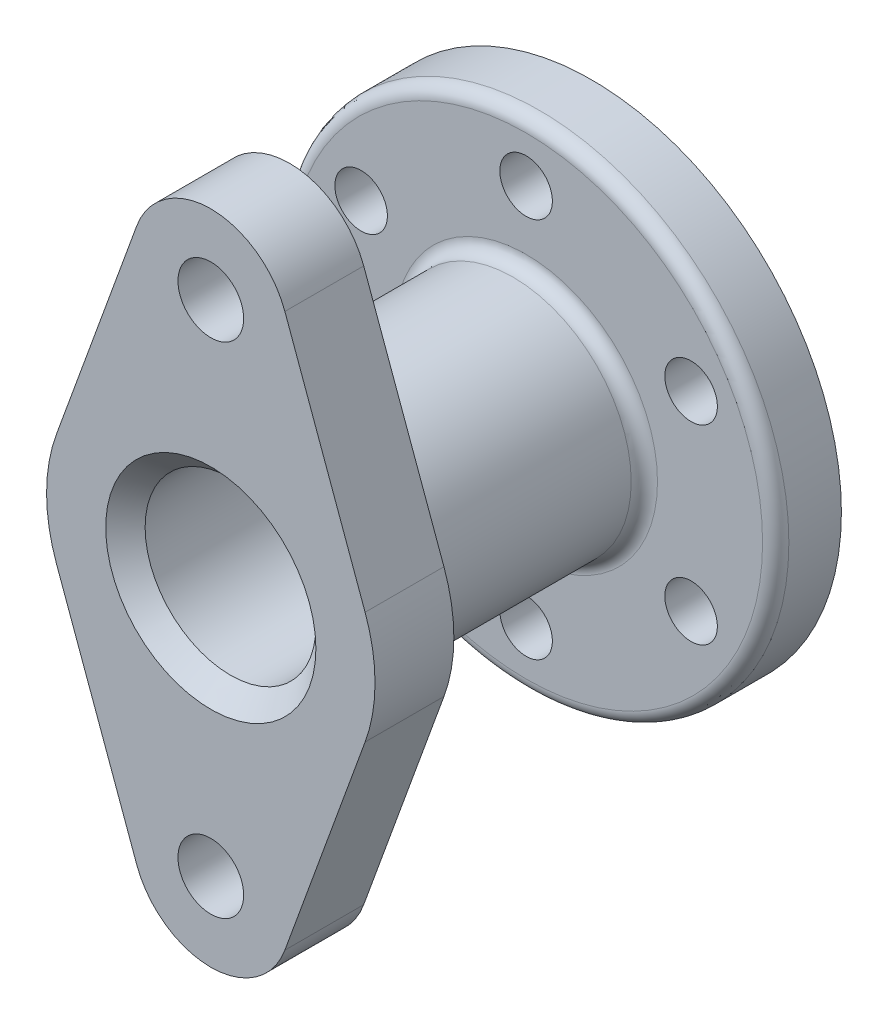
ISO-10303-21;
HEADER;
FILE_DESCRIPTION(('STEP AP214'),'2;1');
FILE_NAME('part.step','',(''),(''),'','','');
FILE_SCHEMA(('AUTOMOTIVE_DESIGN { 1 0 10303 214 1 1 1 1 }'));
ENDSEC;
DATA;
#1=APPLICATION_CONTEXT('core data for automotive mechanical design processes');
#2=APPLICATION_PROTOCOL_DEFINITION('international standard','automotive_design',2000,#1);
#3=PRODUCT_CONTEXT('',#1,'mechanical');
#4=PRODUCT('Part','Part','',(#3));
#5=PRODUCT_RELATED_PRODUCT_CATEGORY('part','',(#4));
#6=PRODUCT_DEFINITION_FORMATION('','',#4);
#7=PRODUCT_DEFINITION_CONTEXT('part definition',#1,'design');
#8=PRODUCT_DEFINITION('design','',#6,#7);
#9=PRODUCT_DEFINITION_SHAPE('','',#8);
#10=(LENGTH_UNIT() NAMED_UNIT(*) SI_UNIT(.MILLI.,.METRE.));
#11=(NAMED_UNIT(*) PLANE_ANGLE_UNIT() SI_UNIT($,.RADIAN.));
#12=(NAMED_UNIT(*) SI_UNIT($,.STERADIAN.) SOLID_ANGLE_UNIT());
#13=UNCERTAINTY_MEASURE_WITH_UNIT(LENGTH_MEASURE(1.E-05),#10,'distance_accuracy_value','');
#14=(GEOMETRIC_REPRESENTATION_CONTEXT(3) GLOBAL_UNCERTAINTY_ASSIGNED_CONTEXT((#13)) GLOBAL_UNIT_ASSIGNED_CONTEXT((#10,
#11,#12)) REPRESENTATION_CONTEXT('',''));
#15=CARTESIAN_POINT('',(0.,0.,0.));
#16=DIRECTION('',(0.,0.,1.));
#17=DIRECTION('',(1.,0.,0.));
#18=AXIS2_PLACEMENT_3D('',#15,#16,#17);
#19=CARTESIAN_POINT('',(0.,0.,0.));
#20=DIRECTION('',(0.,0.,-1.));
#21=DIRECTION('',(-1.,0.,0.));
#22=AXIS2_PLACEMENT_3D('',#19,#20,#21);
#23=CYLINDRICAL_SURFACE('',#22,18.);
#24=CARTESIAN_POINT('',(0.,0.,44.));
#25=DIRECTION('',(0.,0.,1.));
#26=DIRECTION('',(1.,0.,0.));
#27=AXIS2_PLACEMENT_3D('',#24,#25,#26);
#28=CIRCLE('',#27,18.);
#29=CARTESIAN_POINT('',(18.,0.,44.));
#30=VERTEX_POINT('',#29);
#31=EDGE_CURVE('E219',#30,#30,#28,.F.);
#32=ORIENTED_EDGE('',*,*,#31,.T.);
#33=EDGE_LOOP('',(#32));
#34=FACE_BOUND('',#33,.T.);
#35=CARTESIAN_POINT('',(0.,0.,12.));
#36=DIRECTION('',(0.,0.,1.));
#37=DIRECTION('',(1.,0.,0.));
#38=AXIS2_PLACEMENT_3D('',#35,#36,#37);
#39=CIRCLE('',#38,18.);
#40=CARTESIAN_POINT('',(18.,0.,12.));
#41=VERTEX_POINT('',#40);
#42=EDGE_CURVE('E216',#41,#41,#39,.T.);
#43=ORIENTED_EDGE('',*,*,#42,.T.);
#44=EDGE_LOOP('',(#43));
#45=FACE_BOUND('',#44,.T.);
#46=ADVANCED_FACE('F30',(#34,#45),#23,.T.);
#47=CARTESIAN_POINT('',(0.,0.,0.));
#48=DIRECTION('',(0.,0.,-1.));
#49=DIRECTION('',(-1.,0.,0.));
#50=AXIS2_PLACEMENT_3D('',#47,#48,#49);
#51=PLANE('',#50);
#52=CARTESIAN_POINT('',(0.,0.,0.));
#53=DIRECTION('',(0.,0.,-1.));
#54=DIRECTION('',(-1.,0.,0.));
#55=AXIS2_PLACEMENT_3D('',#52,#53,#54);
#56=CIRCLE('',#55,9.99999999999999);
#57=CARTESIAN_POINT('',(-9.99999999999999,0.,0.));
#58=VERTEX_POINT('',#57);
#59=EDGE_CURVE('E550',#58,#58,#56,.T.);
#60=ORIENTED_EDGE('',*,*,#59,.F.);
#61=EDGE_LOOP('',(#60));
#62=FACE_BOUND('',#61,.T.);
#63=CARTESIAN_POINT('',(-25.1147367097486,14.5000000000003,0.));
#64=DIRECTION('',(0.,0.,1.));
#65=DIRECTION('',(0.50000000000001,0.866025403784433,0.));
#66=AXIS2_PLACEMENT_3D('',#63,#64,#65);
#67=CIRCLE('',#66,4.);
#68=CARTESIAN_POINT('',(-23.1147367097485,17.964101615138,0.));
#69=VERTEX_POINT('',#68);
#70=EDGE_CURVE('E172',#69,#69,#67,.T.);
#71=ORIENTED_EDGE('',*,*,#70,.T.);
#72=EDGE_LOOP('',(#71));
#73=FACE_BOUND('',#72,.T.);
#74=CARTESIAN_POINT('',(-25.1147367097489,-14.4999999999998,0.));
#75=DIRECTION('',(0.,0.,1.));
#76=DIRECTION('',(-0.499999999999992,0.866025403784443,0.));
#77=AXIS2_PLACEMENT_3D('',#74,#75,#76);
#78=CIRCLE('',#77,4.);
#79=CARTESIAN_POINT('',(-27.1147367097488,-11.035898384862,0.));
#80=VERTEX_POINT('',#79);
#81=EDGE_CURVE('E178',#80,#80,#78,.T.);
#82=ORIENTED_EDGE('',*,*,#81,.T.);
#83=EDGE_LOOP('',(#82));
#84=FACE_BOUND('',#83,.T.);
#85=CARTESIAN_POINT('',(-2.02506034944344E-13,-29.,0.));
#86=DIRECTION('',(0.,0.,1.));
#87=DIRECTION('',(-1.,0.,0.));
#88=AXIS2_PLACEMENT_3D('',#85,#86,#87);
#89=CIRCLE('',#88,4.);
#90=CARTESIAN_POINT('',(-4.0000000000002,-29.,0.));
#91=VERTEX_POINT('',#90);
#92=EDGE_CURVE('E184',#91,#91,#89,.T.);
#93=ORIENTED_EDGE('',*,*,#92,.T.);
#94=EDGE_LOOP('',(#93));
#95=FACE_BOUND('',#94,.T.);
#96=CARTESIAN_POINT('',(25.1147367097487,-14.5000000000001,0.));
#97=DIRECTION('',(0.,0.,1.));
#98=DIRECTION('',(-0.500000000000004,-0.866025403784436,0.));
#99=AXIS2_PLACEMENT_3D('',#96,#97,#98);
#100=CIRCLE('',#99,4.);
#101=CARTESIAN_POINT('',(23.1147367097486,-17.9641016151379,0.));
#102=VERTEX_POINT('',#101);
#103=EDGE_CURVE('E190',#102,#102,#100,.T.);
#104=ORIENTED_EDGE('',*,*,#103,.T.);
#105=EDGE_LOOP('',(#104));
#106=FACE_BOUND('',#105,.T.);
#107=CARTESIAN_POINT('',(25.1147367097488,14.4999999999999,0.));
#108=DIRECTION('',(0.,0.,1.));
#109=DIRECTION('',(0.499999999999998,-0.86602540378444,0.));
#110=AXIS2_PLACEMENT_3D('',#107,#108,#109);
#111=CIRCLE('',#110,4.);
#112=CARTESIAN_POINT('',(27.1147367097487,11.0358983848622,0.));
#113=VERTEX_POINT('',#112);
#114=EDGE_CURVE('E196',#113,#113,#111,.T.);
#115=ORIENTED_EDGE('',*,*,#114,.T.);
#116=EDGE_LOOP('',(#115));
#117=FACE_BOUND('',#116,.T.);
#118=CARTESIAN_POINT('',(0.,29.,0.));
#119=DIRECTION('',(0.,0.,1.));
#120=DIRECTION('',(1.,0.,0.));
#121=AXIS2_PLACEMENT_3D('',#118,#119,#120);
#122=CIRCLE('',#121,4.);
#123=CARTESIAN_POINT('',(4.,29.,0.));
#124=VERTEX_POINT('',#123);
#125=EDGE_CURVE('E202',#124,#124,#122,.T.);
#126=ORIENTED_EDGE('',*,*,#125,.T.);
#127=EDGE_LOOP('',(#126));
#128=FACE_BOUND('',#127,.T.);
#129=CARTESIAN_POINT('',(0.,0.,0.));
#130=DIRECTION('',(0.,0.,-1.));
#131=DIRECTION('',(-1.,0.,0.));
#132=AXIS2_PLACEMENT_3D('',#129,#130,#131);
#133=CIRCLE('',#132,38.);
#134=CARTESIAN_POINT('',(-38.,0.,0.));
#135=VERTEX_POINT('',#134);
#136=EDGE_CURVE('E205',#135,#135,#133,.T.);
#137=ORIENTED_EDGE('',*,*,#136,.T.);
#138=EDGE_LOOP('',(#137));
#139=FACE_BOUND('',#138,.T.);
#140=ADVANCED_FACE('F247',(#62,#73,#84,#95,#106,#117,#128,#139),#51,.T.);
#141=CARTESIAN_POINT('',(0.,0.,0.));
#142=DIRECTION('',(0.,0.,-1.));
#143=DIRECTION('',(-1.,0.,0.));
#144=AXIS2_PLACEMENT_3D('',#141,#142,#143);
#145=CYLINDRICAL_SURFACE('',#144,38.);
#146=CARTESIAN_POINT('',(0.,0.,8.));
#147=DIRECTION('',(0.,0.,1.));
#148=DIRECTION('',(1.,0.,0.));
#149=AXIS2_PLACEMENT_3D('',#146,#147,#148);
#150=CIRCLE('',#149,38.);
#151=CARTESIAN_POINT('',(38.,0.,8.));
#152=VERTEX_POINT('',#151);
#153=EDGE_CURVE('E11',#152,#152,#150,.F.);
#154=ORIENTED_EDGE('',*,*,#153,.T.);
#155=EDGE_LOOP('',(#154));
#156=FACE_BOUND('',#155,.T.);
#157=ORIENTED_EDGE('',*,*,#136,.F.);
#158=EDGE_LOOP('',(#157));
#159=FACE_BOUND('',#158,.T.);
#160=ADVANCED_FACE('F253',(#156,#159),#145,.T.);
#161=CARTESIAN_POINT('',(0.,38.,10.));
#162=DIRECTION('',(0.,0.,1.));
#163=DIRECTION('',(1.,0.,0.));
#164=AXIS2_PLACEMENT_3D('',#161,#162,#163);
#165=PLANE('',#164);
#166=CARTESIAN_POINT('',(0.,0.,10.));
#167=DIRECTION('',(0.,0.,1.));
#168=DIRECTION('',(1.,0.,0.));
#169=AXIS2_PLACEMENT_3D('',#166,#167,#168);
#170=CIRCLE('',#169,20.);
#171=CARTESIAN_POINT('',(20.,0.,10.));
#172=VERTEX_POINT('',#171);
#173=EDGE_CURVE('E39',#172,#172,#170,.F.);
#174=ORIENTED_EDGE('',*,*,#173,.T.);
#175=EDGE_LOOP('',(#174));
#176=FACE_BOUND('',#175,.T.);
#177=CARTESIAN_POINT('',(0.,0.,10.));
#178=DIRECTION('',(0.,0.,1.));
#179=DIRECTION('',(1.,0.,0.));
#180=AXIS2_PLACEMENT_3D('',#177,#178,#179);
#181=CIRCLE('',#180,36.);
#182=CARTESIAN_POINT('',(36.,0.,10.));
#183=VERTEX_POINT('',#182);
#184=EDGE_CURVE('E225',#183,#183,#181,.T.);
#185=ORIENTED_EDGE('',*,*,#184,.T.);
#186=EDGE_LOOP('',(#185));
#187=FACE_BOUND('',#186,.T.);
#188=CARTESIAN_POINT('',(-25.1147367097486,14.5000000000003,10.));
#189=DIRECTION('',(0.,0.,1.));
#190=DIRECTION('',(0.50000000000001,0.866025403784433,0.));
#191=AXIS2_PLACEMENT_3D('',#188,#189,#190);
#192=CIRCLE('',#191,4.);
#193=CARTESIAN_POINT('',(-23.1147367097485,17.964101615138,10.));
#194=VERTEX_POINT('',#193);
#195=EDGE_CURVE('E161',#194,#194,#192,.T.);
#196=ORIENTED_EDGE('',*,*,#195,.F.);
#197=EDGE_LOOP('',(#196));
#198=FACE_BOUND('',#197,.T.);
#199=CARTESIAN_POINT('',(-25.1147367097489,-14.4999999999998,10.));
#200=DIRECTION('',(0.,0.,1.));
#201=DIRECTION('',(-0.499999999999992,0.866025403784443,0.));
#202=AXIS2_PLACEMENT_3D('',#199,#200,#201);
#203=CIRCLE('',#202,4.);
#204=CARTESIAN_POINT('',(-27.1147367097488,-11.035898384862,10.));
#205=VERTEX_POINT('',#204);
#206=EDGE_CURVE('E175',#205,#205,#203,.T.);
#207=ORIENTED_EDGE('',*,*,#206,.F.);
#208=EDGE_LOOP('',(#207));
#209=FACE_BOUND('',#208,.T.);
#210=CARTESIAN_POINT('',(-2.02506034944344E-13,-29.,10.));
#211=DIRECTION('',(0.,0.,1.));
#212=DIRECTION('',(-1.,0.,0.));
#213=AXIS2_PLACEMENT_3D('',#210,#211,#212);
#214=CIRCLE('',#213,4.);
#215=CARTESIAN_POINT('',(-4.0000000000002,-29.,10.));
#216=VERTEX_POINT('',#215);
#217=EDGE_CURVE('E181',#216,#216,#214,.T.);
#218=ORIENTED_EDGE('',*,*,#217,.F.);
#219=EDGE_LOOP('',(#218));
#220=FACE_BOUND('',#219,.T.);
#221=CARTESIAN_POINT('',(25.1147367097487,-14.5000000000001,10.));
#222=DIRECTION('',(0.,0.,1.));
#223=DIRECTION('',(-0.500000000000004,-0.866025403784436,0.));
#224=AXIS2_PLACEMENT_3D('',#221,#222,#223);
#225=CIRCLE('',#224,4.);
#226=CARTESIAN_POINT('',(23.1147367097486,-17.9641016151379,10.));
#227=VERTEX_POINT('',#226);
#228=EDGE_CURVE('E187',#227,#227,#225,.T.);
#229=ORIENTED_EDGE('',*,*,#228,.F.);
#230=EDGE_LOOP('',(#229));
#231=FACE_BOUND('',#230,.T.);
#232=CARTESIAN_POINT('',(25.1147367097488,14.4999999999999,10.));
#233=DIRECTION('',(0.,0.,1.));
#234=DIRECTION('',(0.499999999999998,-0.86602540378444,0.));
#235=AXIS2_PLACEMENT_3D('',#232,#233,#234);
#236=CIRCLE('',#235,4.);
#237=CARTESIAN_POINT('',(27.1147367097487,11.0358983848622,10.));
#238=VERTEX_POINT('',#237);
#239=EDGE_CURVE('E193',#238,#238,#236,.T.);
#240=ORIENTED_EDGE('',*,*,#239,.F.);
#241=EDGE_LOOP('',(#240));
#242=FACE_BOUND('',#241,.T.);
#243=CARTESIAN_POINT('',(0.,29.,10.));
#244=DIRECTION('',(0.,0.,1.));
#245=DIRECTION('',(1.,0.,0.));
#246=AXIS2_PLACEMENT_3D('',#243,#244,#245);
#247=CIRCLE('',#246,4.);
#248=CARTESIAN_POINT('',(4.,29.,10.));
#249=VERTEX_POINT('',#248);
#250=EDGE_CURVE('E199',#249,#249,#247,.T.);
#251=ORIENTED_EDGE('',*,*,#250,.F.);
#252=EDGE_LOOP('',(#251));
#253=FACE_BOUND('',#252,.T.);
#254=ADVANCED_FACE('F230',(#176,#187,#198,#209,#220,#231,#242,#253),#165,.T.);
#255=CARTESIAN_POINT('',(0.,29.,0.));
#256=DIRECTION('',(0.,0.,1.));
#257=DIRECTION('',(1.,0.,0.));
#258=AXIS2_PLACEMENT_3D('',#255,#256,#257);
#259=CYLINDRICAL_SURFACE('',#258,4.);
#260=ORIENTED_EDGE('',*,*,#125,.F.);
#261=EDGE_LOOP('',(#260));
#262=FACE_BOUND('',#261,.T.);
#263=ORIENTED_EDGE('',*,*,#250,.T.);
#264=EDGE_LOOP('',(#263));
#265=FACE_BOUND('',#264,.T.);
#266=ADVANCED_FACE('F263',(#262,#265),#259,.F.);
#267=CARTESIAN_POINT('',(25.1147367097488,14.4999999999999,0.));
#268=DIRECTION('',(0.,0.,1.));
#269=DIRECTION('',(1.,0.,0.));
#270=AXIS2_PLACEMENT_3D('',#267,#268,#269);
#271=CYLINDRICAL_SURFACE('',#270,4.);
#272=ORIENTED_EDGE('',*,*,#114,.F.);
#273=EDGE_LOOP('',(#272));
#274=FACE_BOUND('',#273,.T.);
#275=ORIENTED_EDGE('',*,*,#239,.T.);
#276=EDGE_LOOP('',(#275));
#277=FACE_BOUND('',#276,.T.);
#278=ADVANCED_FACE('F342',(#274,#277),#271,.F.);
#279=CARTESIAN_POINT('',(25.1147367097487,-14.5000000000001,0.));
#280=DIRECTION('',(0.,0.,1.));
#281=DIRECTION('',(1.,0.,0.));
#282=AXIS2_PLACEMENT_3D('',#279,#280,#281);
#283=CYLINDRICAL_SURFACE('',#282,4.);
#284=ORIENTED_EDGE('',*,*,#103,.F.);
#285=EDGE_LOOP('',(#284));
#286=FACE_BOUND('',#285,.T.);
#287=ORIENTED_EDGE('',*,*,#228,.T.);
#288=EDGE_LOOP('',(#287));
#289=FACE_BOUND('',#288,.T.);
#290=ADVANCED_FACE('F338',(#286,#289),#283,.F.);
#291=CARTESIAN_POINT('',(-2.02506034944344E-13,-29.,0.));
#292=DIRECTION('',(0.,0.,1.));
#293=DIRECTION('',(1.,0.,0.));
#294=AXIS2_PLACEMENT_3D('',#291,#292,#293);
#295=CYLINDRICAL_SURFACE('',#294,4.);
#296=ORIENTED_EDGE('',*,*,#92,.F.);
#297=EDGE_LOOP('',(#296));
#298=FACE_BOUND('',#297,.T.);
#299=ORIENTED_EDGE('',*,*,#217,.T.);
#300=EDGE_LOOP('',(#299));
#301=FACE_BOUND('',#300,.T.);
#302=ADVANCED_FACE('F334',(#298,#301),#295,.F.);
#303=CARTESIAN_POINT('',(-25.1147367097489,-14.4999999999998,0.));
#304=DIRECTION('',(0.,0.,1.));
#305=DIRECTION('',(1.,0.,0.));
#306=AXIS2_PLACEMENT_3D('',#303,#304,#305);
#307=CYLINDRICAL_SURFACE('',#306,4.);
#308=ORIENTED_EDGE('',*,*,#81,.F.);
#309=EDGE_LOOP('',(#308));
#310=FACE_BOUND('',#309,.T.);
#311=ORIENTED_EDGE('',*,*,#206,.T.);
#312=EDGE_LOOP('',(#311));
#313=FACE_BOUND('',#312,.T.);
#314=ADVANCED_FACE('F330',(#310,#313),#307,.F.);
#315=CARTESIAN_POINT('',(-25.1147367097486,14.5000000000003,0.));
#316=DIRECTION('',(0.,0.,1.));
#317=DIRECTION('',(1.,0.,0.));
#318=AXIS2_PLACEMENT_3D('',#315,#316,#317);
#319=CYLINDRICAL_SURFACE('',#318,4.);
#320=ORIENTED_EDGE('',*,*,#70,.F.);
#321=EDGE_LOOP('',(#320));
#322=FACE_BOUND('',#321,.T.);
#323=ORIENTED_EDGE('',*,*,#195,.T.);
#324=EDGE_LOOP('',(#323));
#325=FACE_BOUND('',#324,.T.);
#326=ADVANCED_FACE('F325',(#322,#325),#319,.F.);
#327=CARTESIAN_POINT('',(0.,38.,46.));
#328=DIRECTION('',(0.,0.,1.));
#329=DIRECTION('',(1.,0.,0.));
#330=AXIS2_PLACEMENT_3D('',#327,#328,#329);
#331=CYLINDRICAL_SURFACE('',#330,12.);
#332=CARTESIAN_POINT('',(0.,38.,58.));
#333=DIRECTION('',(0.,0.,1.));
#334=DIRECTION('',(1.,0.,0.));
#335=AXIS2_PLACEMENT_3D('',#332,#333,#334);
#336=CIRCLE('',#335,12.);
#337=CARTESIAN_POINT('',(-11.275939624015,42.1052631578947,58.));
#338=VERTEX_POINT('',#337);
#339=CARTESIAN_POINT('',(11.275939624015,42.1052631578947,58.));
#340=VERTEX_POINT('',#339);
#341=EDGE_CURVE('E137',#338,#340,#336,.F.);
#342=ORIENTED_EDGE('',*,*,#341,.T.);
#343=DIRECTION('',(0.,0.,1.));
#344=VECTOR('',#343,1.);
#345=CARTESIAN_POINT('',(11.275939624015,42.1052631578947,46.));
#346=LINE('',#345,#344);
#347=CARTESIAN_POINT('',(11.275939624015,42.1052631578947,46.));
#348=VERTEX_POINT('',#347);
#349=EDGE_CURVE('E159',#348,#340,#346,.T.);
#350=ORIENTED_EDGE('',*,*,#349,.F.);
#351=CARTESIAN_POINT('',(0.,38.,46.));
#352=DIRECTION('',(0.,0.,1.));
#353=DIRECTION('',(1.,0.,0.));
#354=AXIS2_PLACEMENT_3D('',#351,#352,#353);
#355=CIRCLE('',#354,12.);
#356=CARTESIAN_POINT('',(-11.275939624015,42.1052631578947,46.));
#357=VERTEX_POINT('',#356);
#358=EDGE_CURVE('E556',#357,#348,#355,.F.);
#359=ORIENTED_EDGE('',*,*,#358,.F.);
#360=DIRECTION('',(0.,0.,1.));
#361=VECTOR('',#360,1.);
#362=CARTESIAN_POINT('',(-11.275939624015,42.1052631578947,46.));
#363=LINE('',#362,#361);
#364=EDGE_CURVE('E133',#357,#338,#363,.T.);
#365=ORIENTED_EDGE('',*,*,#364,.T.);
#366=EDGE_LOOP('',(#342,#350,#359,#365));
#367=FACE_BOUND('',#366,.T.);
#368=ADVANCED_FACE('F307',(#367),#331,.T.);
#369=CARTESIAN_POINT('',(51.4922890022177,-68.3571140504545,46.));
#370=DIRECTION('',(-0.939661635334585,-0.342105263157895,0.));
#371=DIRECTION('',(0.342105263157895,-0.939661635334586,0.));
#372=AXIS2_PLACEMENT_3D('',#369,#370,#371);
#373=PLANE('',#372);
#374=DIRECTION('',(0.342105263157895,-0.939661635334586,0.));
#375=VECTOR('',#374,1.);
#376=CARTESIAN_POINT('',(51.4922890022177,-68.3571140504545,58.));
#377=LINE('',#376,#375);
#378=CARTESIAN_POINT('',(23.4915408833646,8.55263157894738,58.));
#379=VERTEX_POINT('',#378);
#380=EDGE_CURVE('E82',#340,#379,#377,.T.);
#381=ORIENTED_EDGE('',*,*,#380,.T.);
#382=DIRECTION('',(0.,0.,1.));
#383=VECTOR('',#382,1.);
#384=CARTESIAN_POINT('',(23.4915408833646,8.55263157894738,46.));
#385=LINE('',#384,#383);
#386=CARTESIAN_POINT('',(23.4915408833646,8.55263157894738,46.));
#387=VERTEX_POINT('',#386);
#388=EDGE_CURVE('E75',#387,#379,#385,.T.);
#389=ORIENTED_EDGE('',*,*,#388,.F.);
#390=DIRECTION('',(0.342105263157895,-0.939661635334586,0.));
#391=VECTOR('',#390,1.);
#392=CARTESIAN_POINT('',(51.4922890022177,-68.3571140504545,46.));
#393=LINE('',#392,#391);
#394=EDGE_CURVE('E47',#348,#387,#393,.T.);
#395=ORIENTED_EDGE('',*,*,#394,.F.);
#396=ORIENTED_EDGE('',*,*,#349,.T.);
#397=EDGE_LOOP('',(#381,#389,#395,#396));
#398=FACE_BOUND('',#397,.T.);
#399=ADVANCED_FACE('F304',(#398),#373,.F.);
#400=CARTESIAN_POINT('',(0.,0.,46.));
#401=DIRECTION('',(0.,0.,1.));
#402=DIRECTION('',(1.,0.,0.));
#403=AXIS2_PLACEMENT_3D('',#400,#401,#402);
#404=CYLINDRICAL_SURFACE('',#403,25.);
#405=CARTESIAN_POINT('',(0.,0.,58.));
#406=DIRECTION('',(0.,0.,1.));
#407=DIRECTION('',(1.,0.,0.));
#408=AXIS2_PLACEMENT_3D('',#405,#406,#407);
#409=CIRCLE('',#408,25.);
#410=CARTESIAN_POINT('',(23.4915408833646,-8.55263157894737,58.));
#411=VERTEX_POINT('',#410);
#412=EDGE_CURVE('E107',#411,#379,#409,.T.);
#413=ORIENTED_EDGE('',*,*,#412,.F.);
#414=DIRECTION('',(0.,0.,1.));
#415=VECTOR('',#414,1.);
#416=CARTESIAN_POINT('',(23.4915408833646,-8.55263157894737,46.));
#417=LINE('',#416,#415);
#418=CARTESIAN_POINT('',(23.4915408833646,-8.55263157894737,46.));
#419=VERTEX_POINT('',#418);
#420=EDGE_CURVE('E103',#419,#411,#417,.T.);
#421=ORIENTED_EDGE('',*,*,#420,.F.);
#422=CARTESIAN_POINT('',(0.,0.,46.));
#423=DIRECTION('',(0.,0.,1.));
#424=DIRECTION('',(1.,0.,0.));
#425=AXIS2_PLACEMENT_3D('',#422,#423,#424);
#426=CIRCLE('',#425,25.);
#427=EDGE_CURVE('E106',#419,#387,#426,.T.);
#428=ORIENTED_EDGE('',*,*,#427,.T.);
#429=ORIENTED_EDGE('',*,*,#388,.T.);
#430=EDGE_LOOP('',(#413,#421,#428,#429));
#431=FACE_BOUND('',#430,.T.);
#432=ADVANCED_FACE('F105',(#431),#404,.T.);
#433=CARTESIAN_POINT('',(-4.50920723548843,-85.4623772083493,46.));
#434=DIRECTION('',(0.939661635334585,-0.342105263157895,0.));
#435=DIRECTION('',(0.342105263157895,0.939661635334586,0.));
#436=AXIS2_PLACEMENT_3D('',#433,#434,#435);
#437=PLANE('',#436);
#438=DIRECTION('',(0.342105263157895,0.939661635334586,0.));
#439=VECTOR('',#438,1.);
#440=CARTESIAN_POINT('',(-4.50920723548843,-85.4623772083493,58.));
#441=LINE('',#440,#439);
#442=CARTESIAN_POINT('',(11.275939624015,-42.1052631578947,58.));
#443=VERTEX_POINT('',#442);
#444=EDGE_CURVE('E152',#443,#411,#441,.T.);
#445=ORIENTED_EDGE('',*,*,#444,.F.);
#446=DIRECTION('',(0.,0.,1.));
#447=VECTOR('',#446,1.);
#448=CARTESIAN_POINT('',(11.275939624015,-42.1052631578947,46.));
#449=LINE('',#448,#447);
#450=CARTESIAN_POINT('',(11.275939624015,-42.1052631578947,46.));
#451=VERTEX_POINT('',#450);
#452=EDGE_CURVE('E112',#451,#443,#449,.T.);
#453=ORIENTED_EDGE('',*,*,#452,.F.);
#454=DIRECTION('',(0.342105263157895,0.939661635334586,0.));
#455=VECTOR('',#454,1.);
#456=CARTESIAN_POINT('',(-4.50920723548843,-85.4623772083493,46.));
#457=LINE('',#456,#455);
#458=EDGE_CURVE('E118',#451,#419,#457,.T.);
#459=ORIENTED_EDGE('',*,*,#458,.T.);
#460=ORIENTED_EDGE('',*,*,#420,.T.);
#461=EDGE_LOOP('',(#445,#453,#459,#460));
#462=FACE_BOUND('',#461,.T.);
#463=ADVANCED_FACE('F122',(#462),#437,.T.);
#464=CARTESIAN_POINT('',(0.,-38.,46.));
#465=DIRECTION('',(0.,0.,1.));
#466=DIRECTION('',(1.,0.,0.));
#467=AXIS2_PLACEMENT_3D('',#464,#465,#466);
#468=CYLINDRICAL_SURFACE('',#467,12.);
#469=CARTESIAN_POINT('',(0.,-38.,58.));
#470=DIRECTION('',(0.,0.,1.));
#471=DIRECTION('',(1.,0.,0.));
#472=AXIS2_PLACEMENT_3D('',#469,#470,#471);
#473=CIRCLE('',#472,12.);
#474=CARTESIAN_POINT('',(-11.275939624015,-42.1052631578947,58.));
#475=VERTEX_POINT('',#474);
#476=EDGE_CURVE('E149',#475,#443,#473,.T.);
#477=ORIENTED_EDGE('',*,*,#476,.F.);
#478=DIRECTION('',(0.,0.,1.));
#479=VECTOR('',#478,1.);
#480=CARTESIAN_POINT('',(-11.275939624015,-42.1052631578947,46.));
#481=LINE('',#480,#479);
#482=CARTESIAN_POINT('',(-11.275939624015,-42.1052631578947,46.));
#483=VERTEX_POINT('',#482);
#484=EDGE_CURVE('E164',#483,#475,#481,.T.);
#485=ORIENTED_EDGE('',*,*,#484,.F.);
#486=CARTESIAN_POINT('',(0.,-38.,46.));
#487=DIRECTION('',(0.,0.,1.));
#488=DIRECTION('',(1.,0.,0.));
#489=AXIS2_PLACEMENT_3D('',#486,#487,#488);
#490=CIRCLE('',#489,12.);
#491=EDGE_CURVE('E123',#483,#451,#490,.T.);
#492=ORIENTED_EDGE('',*,*,#491,.T.);
#493=ORIENTED_EDGE('',*,*,#452,.T.);
#494=EDGE_LOOP('',(#477,#485,#492,#493));
#495=FACE_BOUND('',#494,.T.);
#496=ADVANCED_FACE('F313',(#495),#468,.T.);
#497=CARTESIAN_POINT('',(4.50920723548843,-85.4623772083493,46.));
#498=DIRECTION('',(-0.939661635334585,-0.342105263157895,0.));
#499=DIRECTION('',(0.342105263157895,-0.939661635334586,0.));
#500=AXIS2_PLACEMENT_3D('',#497,#498,#499);
#501=PLANE('',#500);
#502=DIRECTION('',(0.342105263157895,-0.939661635334586,0.));
#503=VECTOR('',#502,1.);
#504=CARTESIAN_POINT('',(4.50920723548843,-85.4623772083493,58.));
#505=LINE('',#504,#503);
#506=CARTESIAN_POINT('',(-23.4915408833646,-8.55263157894737,58.));
#507=VERTEX_POINT('',#506);
#508=EDGE_CURVE('E146',#507,#475,#505,.T.);
#509=ORIENTED_EDGE('',*,*,#508,.F.);
#510=DIRECTION('',(0.,0.,1.));
#511=VECTOR('',#510,1.);
#512=CARTESIAN_POINT('',(-23.4915408833646,-8.55263157894737,46.));
#513=LINE('',#512,#511);
#514=CARTESIAN_POINT('',(-23.4915408833646,-8.55263157894737,46.));
#515=VERTEX_POINT('',#514);
#516=EDGE_CURVE('E166',#515,#507,#513,.T.);
#517=ORIENTED_EDGE('',*,*,#516,.F.);
#518=DIRECTION('',(0.342105263157895,-0.939661635334586,0.));
#519=VECTOR('',#518,1.);
#520=CARTESIAN_POINT('',(4.50920723548843,-85.4623772083493,46.));
#521=LINE('',#520,#519);
#522=EDGE_CURVE('E125',#515,#483,#521,.T.);
#523=ORIENTED_EDGE('',*,*,#522,.T.);
#524=ORIENTED_EDGE('',*,*,#484,.T.);
#525=EDGE_LOOP('',(#509,#517,#523,#524));
#526=FACE_BOUND('',#525,.T.);
#527=ADVANCED_FACE('F316',(#526),#501,.T.);
#528=CARTESIAN_POINT('',(-23.4915408833646,8.55263157894737,58.));
#529=VERTEX_POINT('',#528);
#530=EDGE_CURVE('E143',#529,#507,#409,.T.);
#531=ORIENTED_EDGE('',*,*,#530,.F.);
#532=DIRECTION('',(0.,0.,1.));
#533=VECTOR('',#532,1.);
#534=CARTESIAN_POINT('',(-23.4915408833646,8.55263157894737,46.));
#535=LINE('',#534,#533);
#536=CARTESIAN_POINT('',(-23.4915408833646,8.55263157894737,46.));
#537=VERTEX_POINT('',#536);
#538=EDGE_CURVE('E168',#537,#529,#535,.T.);
#539=ORIENTED_EDGE('',*,*,#538,.F.);
#540=EDGE_CURVE('E121',#537,#515,#426,.T.);
#541=ORIENTED_EDGE('',*,*,#540,.T.);
#542=ORIENTED_EDGE('',*,*,#516,.T.);
#543=EDGE_LOOP('',(#531,#539,#541,#542));
#544=FACE_BOUND('',#543,.T.);
#545=ADVANCED_FACE('F310',(#544),#404,.T.);
#546=CARTESIAN_POINT('',(-51.4922890022177,-68.3571140504545,46.));
#547=DIRECTION('',(0.939661635334585,-0.342105263157895,0.));
#548=DIRECTION('',(0.342105263157895,0.939661635334586,0.));
#549=AXIS2_PLACEMENT_3D('',#546,#547,#548);
#550=PLANE('',#549);
#551=DIRECTION('',(0.342105263157895,0.939661635334586,0.));
#552=VECTOR('',#551,1.);
#553=CARTESIAN_POINT('',(-51.4922890022177,-68.3571140504545,58.));
#554=LINE('',#553,#552);
#555=EDGE_CURVE('E141',#529,#338,#554,.T.);
#556=ORIENTED_EDGE('',*,*,#555,.T.);
#557=ORIENTED_EDGE('',*,*,#364,.F.);
#558=DIRECTION('',(0.342105263157895,0.939661635334586,0.));
#559=VECTOR('',#558,1.);
#560=CARTESIAN_POINT('',(-51.4922890022177,-68.3571140504545,46.));
#561=LINE('',#560,#559);
#562=EDGE_CURVE('E89',#537,#357,#561,.T.);
#563=ORIENTED_EDGE('',*,*,#562,.F.);
#564=ORIENTED_EDGE('',*,*,#538,.T.);
#565=EDGE_LOOP('',(#556,#557,#563,#564));
#566=FACE_BOUND('',#565,.T.);
#567=ADVANCED_FACE('F299',(#566),#550,.F.);
#568=CARTESIAN_POINT('',(0.,38.,46.));
#569=DIRECTION('',(0.,0.,1.));
#570=DIRECTION('',(1.,0.,0.));
#571=AXIS2_PLACEMENT_3D('',#568,#569,#570);
#572=CYLINDRICAL_SURFACE('',#571,5.);
#573=CARTESIAN_POINT('',(0.,38.,46.));
#574=DIRECTION('',(0.,0.,1.));
#575=DIRECTION('',(1.,0.,0.));
#576=AXIS2_PLACEMENT_3D('',#573,#574,#575);
#577=CIRCLE('',#576,5.);
#578=CARTESIAN_POINT('',(5.,38.,46.));
#579=VERTEX_POINT('',#578);
#580=EDGE_CURVE('E158',#579,#579,#577,.T.);
#581=ORIENTED_EDGE('',*,*,#580,.F.);
#582=EDGE_LOOP('',(#581));
#583=FACE_BOUND('',#582,.T.);
#584=CARTESIAN_POINT('',(0.,38.,58.));
#585=DIRECTION('',(0.,0.,1.));
#586=DIRECTION('',(1.,0.,0.));
#587=AXIS2_PLACEMENT_3D('',#584,#585,#586);
#588=CIRCLE('',#587,5.);
#589=CARTESIAN_POINT('',(5.,38.,58.));
#590=VERTEX_POINT('',#589);
#591=EDGE_CURVE('E134',#590,#590,#588,.T.);
#592=ORIENTED_EDGE('',*,*,#591,.T.);
#593=EDGE_LOOP('',(#592));
#594=FACE_BOUND('',#593,.T.);
#595=ADVANCED_FACE('F290',(#583,#594),#572,.F.);
#596=CARTESIAN_POINT('',(0.,-38.,46.));
#597=DIRECTION('',(0.,0.,1.));
#598=DIRECTION('',(1.,0.,0.));
#599=AXIS2_PLACEMENT_3D('',#596,#597,#598);
#600=CYLINDRICAL_SURFACE('',#599,5.);
#601=CARTESIAN_POINT('',(0.,-38.,46.));
#602=DIRECTION('',(0.,0.,1.));
#603=DIRECTION('',(1.,0.,0.));
#604=AXIS2_PLACEMENT_3D('',#601,#602,#603);
#605=CIRCLE('',#604,5.);
#606=CARTESIAN_POINT('',(5.,-38.,46.));
#607=VERTEX_POINT('',#606);
#608=EDGE_CURVE('E130',#607,#607,#605,.F.);
#609=ORIENTED_EDGE('',*,*,#608,.T.);
#610=EDGE_LOOP('',(#609));
#611=FACE_BOUND('',#610,.T.);
#612=CARTESIAN_POINT('',(0.,-38.,58.));
#613=DIRECTION('',(0.,0.,1.));
#614=DIRECTION('',(1.,0.,0.));
#615=AXIS2_PLACEMENT_3D('',#612,#613,#614);
#616=CIRCLE('',#615,5.);
#617=CARTESIAN_POINT('',(5.,-38.,58.));
#618=VERTEX_POINT('',#617);
#619=EDGE_CURVE('E155',#618,#618,#616,.F.);
#620=ORIENTED_EDGE('',*,*,#619,.F.);
#621=EDGE_LOOP('',(#620));
#622=FACE_BOUND('',#621,.T.);
#623=ADVANCED_FACE('F288',(#611,#622),#600,.F.);
#624=CARTESIAN_POINT('',(0.,-87.1040570108677,46.));
#625=DIRECTION('',(0.,0.,1.));
#626=DIRECTION('',(1.,0.,0.));
#627=AXIS2_PLACEMENT_3D('',#624,#625,#626);
#628=PLANE('',#627);
#629=CARTESIAN_POINT('',(0.,0.,46.));
#630=DIRECTION('',(0.,0.,1.));
#631=DIRECTION('',(1.,0.,0.));
#632=AXIS2_PLACEMENT_3D('',#629,#630,#631);
#633=CIRCLE('',#632,20.);
#634=CARTESIAN_POINT('',(20.,0.,46.));
#635=VERTEX_POINT('',#634);
#636=EDGE_CURVE('E222',#635,#635,#633,.T.);
#637=ORIENTED_EDGE('',*,*,#636,.T.);
#638=EDGE_LOOP('',(#637));
#639=FACE_BOUND('',#638,.T.);
#640=ORIENTED_EDGE('',*,*,#580,.T.);
#641=EDGE_LOOP('',(#640));
#642=FACE_BOUND('',#641,.T.);
#643=ORIENTED_EDGE('',*,*,#358,.T.);
#644=ORIENTED_EDGE('',*,*,#394,.T.);
#645=ORIENTED_EDGE('',*,*,#427,.F.);
#646=ORIENTED_EDGE('',*,*,#458,.F.);
#647=ORIENTED_EDGE('',*,*,#491,.F.);
#648=ORIENTED_EDGE('',*,*,#522,.F.);
#649=ORIENTED_EDGE('',*,*,#540,.F.);
#650=ORIENTED_EDGE('',*,*,#562,.T.);
#651=EDGE_LOOP('',(#643,#644,#645,#646,#647,#648,#649,#650));
#652=FACE_BOUND('',#651,.T.);
#653=ORIENTED_EDGE('',*,*,#608,.F.);
#654=EDGE_LOOP('',(#653));
#655=FACE_BOUND('',#654,.T.);
#656=ADVANCED_FACE('F115',(#639,#642,#652,#655),#628,.F.);
#657=CARTESIAN_POINT('',(0.,18.,58.));
#658=DIRECTION('',(0.,0.,1.));
#659=DIRECTION('',(1.,0.,0.));
#660=AXIS2_PLACEMENT_3D('',#657,#658,#659);
#661=PLANE('',#660);
#662=CARTESIAN_POINT('',(0.,0.,58.));
#663=DIRECTION('',(0.,0.,1.));
#664=DIRECTION('',(1.,0.,0.));
#665=AXIS2_PLACEMENT_3D('',#662,#663,#664);
#666=CIRCLE('',#665,16.);
#667=CARTESIAN_POINT('',(16.,0.,58.));
#668=VERTEX_POINT('',#667);
#669=EDGE_CURVE('E210',#668,#668,#666,.F.);
#670=ORIENTED_EDGE('',*,*,#669,.T.);
#671=EDGE_LOOP('',(#670));
#672=FACE_BOUND('',#671,.T.);
#673=ORIENTED_EDGE('',*,*,#591,.F.);
#674=EDGE_LOOP('',(#673));
#675=FACE_BOUND('',#674,.T.);
#676=ORIENTED_EDGE('',*,*,#341,.F.);
#677=ORIENTED_EDGE('',*,*,#555,.F.);
#678=ORIENTED_EDGE('',*,*,#530,.T.);
#679=ORIENTED_EDGE('',*,*,#508,.T.);
#680=ORIENTED_EDGE('',*,*,#476,.T.);
#681=ORIENTED_EDGE('',*,*,#444,.T.);
#682=ORIENTED_EDGE('',*,*,#412,.T.);
#683=ORIENTED_EDGE('',*,*,#380,.F.);
#684=EDGE_LOOP('',(#676,#677,#678,#679,#680,#681,#682,#683));
#685=FACE_BOUND('',#684,.T.);
#686=ORIENTED_EDGE('',*,*,#619,.T.);
#687=EDGE_LOOP('',(#686));
#688=FACE_BOUND('',#687,.T.);
#689=ADVANCED_FACE('F259',(#672,#675,#685,#688),#661,.T.);
#690=CARTESIAN_POINT('',(0.,0.,0.));
#691=DIRECTION('',(0.,0.,-1.));
#692=DIRECTION('',(-1.,0.,0.));
#693=AXIS2_PLACEMENT_3D('',#690,#691,#692);
#694=CYLINDRICAL_SURFACE('',#693,13.);
#695=CARTESIAN_POINT('',(0.,0.,55.));
#696=DIRECTION('',(0.,0.,1.));
#697=DIRECTION('',(1.,0.,0.));
#698=AXIS2_PLACEMENT_3D('',#695,#696,#697);
#699=CIRCLE('',#698,13.);
#700=CARTESIAN_POINT('',(13.,0.,55.));
#701=VERTEX_POINT('',#700);
#702=EDGE_CURVE('E213',#701,#701,#699,.T.);
#703=ORIENTED_EDGE('',*,*,#702,.T.);
#704=EDGE_LOOP('',(#703));
#705=FACE_BOUND('',#704,.T.);
#706=CARTESIAN_POINT('',(0.,0.,33.));
#707=DIRECTION('',(0.,0.,-1.));
#708=DIRECTION('',(-1.,0.,0.));
#709=AXIS2_PLACEMENT_3D('',#706,#707,#708);
#710=CIRCLE('',#709,13.);
#711=CARTESIAN_POINT('',(-13.,0.,33.));
#712=VERTEX_POINT('',#711);
#713=EDGE_CURVE('E138',#712,#712,#710,.T.);
#714=ORIENTED_EDGE('',*,*,#713,.T.);
#715=EDGE_LOOP('',(#714));
#716=FACE_BOUND('',#715,.T.);
#717=ADVANCED_FACE('F282',(#705,#716),#694,.F.);
#718=CARTESIAN_POINT('',(0.,13.,33.));
#719=DIRECTION('',(0.,0.,-1.));
#720=DIRECTION('',(-1.,0.,0.));
#721=AXIS2_PLACEMENT_3D('',#718,#719,#720);
#722=PLANE('',#721);
#723=ORIENTED_EDGE('',*,*,#713,.F.);
#724=EDGE_LOOP('',(#723));
#725=FACE_BOUND('',#724,.T.);
#726=CARTESIAN_POINT('',(0.,0.,33.));
#727=DIRECTION('',(0.,0.,-1.));
#728=DIRECTION('',(-1.,0.,0.));
#729=AXIS2_PLACEMENT_3D('',#726,#727,#728);
#730=CIRCLE('',#729,9.99999999999999);
#731=CARTESIAN_POINT('',(-9.99999999999999,0.,33.));
#732=VERTEX_POINT('',#731);
#733=EDGE_CURVE('E547',#732,#732,#730,.T.);
#734=ORIENTED_EDGE('',*,*,#733,.T.);
#735=EDGE_LOOP('',(#734));
#736=FACE_BOUND('',#735,.T.);
#737=ADVANCED_FACE('F273',(#725,#736),#722,.F.);
#738=CARTESIAN_POINT('',(0.,0.,0.));
#739=DIRECTION('',(0.,0.,-1.));
#740=DIRECTION('',(-1.,0.,0.));
#741=AXIS2_PLACEMENT_3D('',#738,#739,#740);
#742=CYLINDRICAL_SURFACE('',#741,9.99999999999999);
#743=ORIENTED_EDGE('',*,*,#733,.F.);
#744=EDGE_LOOP('',(#743));
#745=FACE_BOUND('',#744,.T.);
#746=ORIENTED_EDGE('',*,*,#59,.T.);
#747=EDGE_LOOP('',(#746));
#748=FACE_BOUND('',#747,.T.);
#749=ADVANCED_FACE('F268',(#745,#748),#742,.F.);
#750=CARTESIAN_POINT('',(0.,0.,58.));
#751=DIRECTION('',(0.,0.,1.));
#752=DIRECTION('',(1.,0.,0.));
#753=AXIS2_PLACEMENT_3D('',#750,#751,#752);
#754=CONICAL_SURFACE('',#753,16.,0.785398163397446);
#755=CARTESIAN_POINT('',(13.,0.,55.));
#756=CARTESIAN_POINT('',(13.03125,0.,55.03125));
#757=CARTESIAN_POINT('',(13.0625,0.,55.0625));
#758=CARTESIAN_POINT('',(13.125,0.,55.125));
#759=CARTESIAN_POINT('',(13.15625,0.,55.15625));
#760=CARTESIAN_POINT('',(13.21875,0.,55.21875));
#761=CARTESIAN_POINT('',(13.25,0.,55.25));
#762=CARTESIAN_POINT('',(13.3125,0.,55.3125));
#763=CARTESIAN_POINT('',(13.34375,0.,55.34375));
#764=CARTESIAN_POINT('',(13.40625,0.,55.40625));
#765=CARTESIAN_POINT('',(13.4375,0.,55.4375));
#766=CARTESIAN_POINT('',(13.5,0.,55.5));
#767=CARTESIAN_POINT('',(13.53125,0.,55.53125));
#768=CARTESIAN_POINT('',(13.59375,0.,55.59375));
#769=CARTESIAN_POINT('',(13.625,0.,55.625));
#770=CARTESIAN_POINT('',(13.6875,0.,55.6875));
#771=CARTESIAN_POINT('',(13.71875,0.,55.71875));
#772=CARTESIAN_POINT('',(13.78125,0.,55.78125));
#773=CARTESIAN_POINT('',(13.8125,0.,55.8125));
#774=CARTESIAN_POINT('',(13.875,0.,55.875));
#775=CARTESIAN_POINT('',(13.90625,0.,55.90625));
#776=CARTESIAN_POINT('',(13.96875,0.,55.96875));
#777=CARTESIAN_POINT('',(14.,0.,56.));
#778=CARTESIAN_POINT('',(14.0625,0.,56.0625));
#779=CARTESIAN_POINT('',(14.09375,0.,56.09375));
#780=CARTESIAN_POINT('',(14.15625,0.,56.15625));
#781=CARTESIAN_POINT('',(14.1875,0.,56.1875));
#782=CARTESIAN_POINT('',(14.25,0.,56.25));
#783=CARTESIAN_POINT('',(14.28125,0.,56.28125));
#784=CARTESIAN_POINT('',(14.34375,0.,56.34375));
#785=CARTESIAN_POINT('',(14.375,0.,56.375));
#786=CARTESIAN_POINT('',(14.4375,0.,56.4375));
#787=CARTESIAN_POINT('',(14.46875,0.,56.46875));
#788=CARTESIAN_POINT('',(14.53125,0.,56.53125));
#789=CARTESIAN_POINT('',(14.5625,0.,56.5625));
#790=CARTESIAN_POINT('',(14.625,0.,56.625));
#791=CARTESIAN_POINT('',(14.65625,0.,56.65625));
#792=CARTESIAN_POINT('',(14.71875,0.,56.71875));
#793=CARTESIAN_POINT('',(14.75,0.,56.75));
#794=CARTESIAN_POINT('',(14.8125,0.,56.8125));
#795=CARTESIAN_POINT('',(14.84375,0.,56.84375));
#796=CARTESIAN_POINT('',(14.90625,0.,56.90625));
#797=CARTESIAN_POINT('',(14.9375,0.,56.9375));
#798=CARTESIAN_POINT('',(15.,0.,57.));
#799=CARTESIAN_POINT('',(15.03125,0.,57.03125));
#800=CARTESIAN_POINT('',(15.09375,0.,57.09375));
#801=CARTESIAN_POINT('',(15.125,0.,57.125));
#802=CARTESIAN_POINT('',(15.1875,0.,57.1875));
#803=CARTESIAN_POINT('',(15.21875,0.,57.21875));
#804=CARTESIAN_POINT('',(15.28125,0.,57.28125));
#805=CARTESIAN_POINT('',(15.3125,0.,57.3125));
#806=CARTESIAN_POINT('',(15.375,0.,57.375));
#807=CARTESIAN_POINT('',(15.40625,0.,57.40625));
#808=CARTESIAN_POINT('',(15.46875,0.,57.46875));
#809=CARTESIAN_POINT('',(15.5,0.,57.5));
#810=CARTESIAN_POINT('',(15.5625,0.,57.5625));
#811=CARTESIAN_POINT('',(15.59375,0.,57.59375));
#812=CARTESIAN_POINT('',(15.65625,0.,57.65625));
#813=CARTESIAN_POINT('',(15.6875,0.,57.6875));
#814=CARTESIAN_POINT('',(15.75,0.,57.75));
#815=CARTESIAN_POINT('',(15.78125,0.,57.78125));
#816=CARTESIAN_POINT('',(15.84375,0.,57.84375));
#817=CARTESIAN_POINT('',(15.875,0.,57.875));
#818=CARTESIAN_POINT('',(15.9375,0.,57.9375));
#819=CARTESIAN_POINT('',(15.96875,0.,57.96875));
#820=CARTESIAN_POINT('',(16.,0.,58.));
#821=B_SPLINE_CURVE_WITH_KNOTS('',3,(#755,#756,#757,#758,#759,#760,#761,#762,#763,#764,#765,
#766,#767,#768,#769,#770,#771,#772,#773,#774,#775,#776,#777,#778,#779,#780,#781,#782,#783,#784,
#785,#786,#787,#788,#789,#790,#791,#792,#793,#794,#795,#796,#797,#798,#799,#800,#801,#802,#803,
#804,#805,#806,#807,#808,#809,#810,#811,#812,#813,#814,#815,#816,#817,#818,#819,#820),
.UNSPECIFIED.,.F.,.F.,(4,2,2,2,2,2,2,2,2,2,2,2,2,2,2,2,2,2,2,2,2,2,2,2,2,2,2,2,2,2,2,2,4),(0.,
0.132582521472481,0.265165042944962,0.397747564417437,0.530330085889917,0.662912607362393,
0.795495128834873,0.928077650307353,1.06066017177983,1.19324269325231,1.32582521472479,
1.45840773619727,1.59099025766975,1.72357277914222,1.8561553006147,1.98873782208718,
2.12132034355966,2.25390286503214,2.38648538650461,2.51906790797709,2.65165042944957,
2.78423295092205,2.91681547239453,3.04939799386701,3.18198051533949,3.31456303681196,
3.44714555828444,3.57972807975692,3.7123106012294,3.84489312270188,3.97747564417435,
4.11005816564683,4.24264068711931),.UNSPECIFIED.);
#822=EDGE_CURVE('BSEAM242',#701,#668,#821,.T.);
#823=ORIENTED_EDGE('',*,*,#702,.F.);
#824=ORIENTED_EDGE('',*,*,#669,.F.);
#825=ORIENTED_EDGE('',*,*,#822,.T.);
#826=ORIENTED_EDGE('',*,*,#822,.F.);
#827=EDGE_LOOP('',(#823,#825,#824,#826));
#828=FACE_BOUND('',#827,.T.);
#829=ADVANCED_FACE('F242',(#828),#754,.F.);
#830=CARTESIAN_POINT('',(0.,0.,44.));
#831=DIRECTION('',(0.,0.,1.));
#832=DIRECTION('',(1.,0.,0.));
#833=AXIS2_PLACEMENT_3D('',#830,#831,#832);
#834=TOROIDAL_SURFACE('',#833,20.,2.);
#835=ORIENTED_EDGE('',*,*,#636,.F.);
#836=EDGE_LOOP('',(#835));
#837=FACE_BOUND('',#836,.T.);
#838=ORIENTED_EDGE('',*,*,#31,.F.);
#839=EDGE_LOOP('',(#838));
#840=FACE_BOUND('',#839,.T.);
#841=ADVANCED_FACE('F235',(#837,#840),#834,.F.);
#842=CARTESIAN_POINT('',(0.,0.,12.));
#843=DIRECTION('',(0.,0.,1.));
#844=DIRECTION('',(1.,0.,0.));
#845=AXIS2_PLACEMENT_3D('',#842,#843,#844);
#846=TOROIDAL_SURFACE('',#845,20.,2.);
#847=ORIENTED_EDGE('',*,*,#42,.F.);
#848=EDGE_LOOP('',(#847));
#849=FACE_BOUND('',#848,.T.);
#850=ORIENTED_EDGE('',*,*,#173,.F.);
#851=EDGE_LOOP('',(#850));
#852=FACE_BOUND('',#851,.T.);
#853=ADVANCED_FACE('F233',(#849,#852),#846,.F.);
#854=CARTESIAN_POINT('',(0.,0.,8.));
#855=DIRECTION('',(0.,0.,1.));
#856=DIRECTION('',(1.,0.,0.));
#857=AXIS2_PLACEMENT_3D('',#854,#855,#856);
#858=TOROIDAL_SURFACE('',#857,36.,2.);
#859=ORIENTED_EDGE('',*,*,#184,.F.);
#860=EDGE_LOOP('',(#859));
#861=FACE_BOUND('',#860,.T.);
#862=ORIENTED_EDGE('',*,*,#153,.F.);
#863=EDGE_LOOP('',(#862));
#864=FACE_BOUND('',#863,.T.);
#865=ADVANCED_FACE('F32',(#861,#864),#858,.T.);
#866=CLOSED_SHELL('',(#46,#140,#160,#254,#266,#278,#290,#302,#314,#326,#368,#399,#432,#463,#496,
#527,#545,#567,#595,#623,#656,#689,#717,#737,#749,#829,#841,#853,#865));
#867=MANIFOLD_SOLID_BREP('B2',#866);
#868=ADVANCED_BREP_SHAPE_REPRESENTATION('',(#18,#867),#14);
#869=SHAPE_DEFINITION_REPRESENTATION(#9,#868);
ENDSEC;
END-ISO-10303-21;
